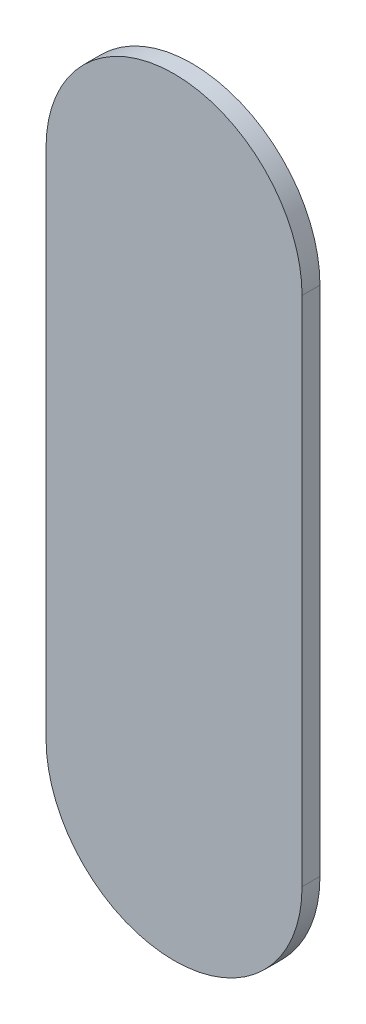
ISO-10303-21;
HEADER;
FILE_DESCRIPTION(('STEP AP214'),'2;1');
FILE_NAME('part.step','',(''),(''),'','','');
FILE_SCHEMA(('AUTOMOTIVE_DESIGN { 1 0 10303 214 1 1 1 1 }'));
ENDSEC;
DATA;
#1=APPLICATION_CONTEXT('core data for automotive mechanical design processes');
#2=APPLICATION_PROTOCOL_DEFINITION('international standard','automotive_design',2000,#1);
#3=PRODUCT_CONTEXT('',#1,'mechanical');
#4=PRODUCT('Part','Part','',(#3));
#5=PRODUCT_RELATED_PRODUCT_CATEGORY('part','',(#4));
#6=PRODUCT_DEFINITION_FORMATION('','',#4);
#7=PRODUCT_DEFINITION_CONTEXT('part definition',#1,'design');
#8=PRODUCT_DEFINITION('design','',#6,#7);
#9=PRODUCT_DEFINITION_SHAPE('','',#8);
#10=(LENGTH_UNIT() NAMED_UNIT(*) SI_UNIT(.MILLI.,.METRE.));
#11=(NAMED_UNIT(*) PLANE_ANGLE_UNIT() SI_UNIT($,.RADIAN.));
#12=(NAMED_UNIT(*) SI_UNIT($,.STERADIAN.) SOLID_ANGLE_UNIT());
#13=UNCERTAINTY_MEASURE_WITH_UNIT(LENGTH_MEASURE(1.E-05),#10,'distance_accuracy_value','');
#14=(GEOMETRIC_REPRESENTATION_CONTEXT(3) GLOBAL_UNCERTAINTY_ASSIGNED_CONTEXT((#13)) GLOBAL_UNIT_ASSIGNED_CONTEXT((#10,
#11,#12)) REPRESENTATION_CONTEXT('',''));
#15=CARTESIAN_POINT('',(0.,0.,0.));
#16=DIRECTION('',(0.,0.,1.));
#17=DIRECTION('',(1.,0.,0.));
#18=AXIS2_PLACEMENT_3D('',#15,#16,#17);
#19=CARTESIAN_POINT('',(83.5925,-108.1375,1.635));
#20=DIRECTION('',(0.,0.,1.));
#21=DIRECTION('',(1.,0.,0.));
#22=AXIS2_PLACEMENT_3D('',#19,#20,#21);
#23=PLANE('',#22);
#24=DIRECTION('',(0.,1.,0.));
#25=VECTOR('',#24,1.);
#26=CARTESIAN_POINT('',(83.5925,-108.1375,1.635));
#27=LINE('',#26,#25);
#28=CARTESIAN_POINT('',(83.5925,-108.1375,1.635));
#29=VERTEX_POINT('',#28);
#30=CARTESIAN_POINT('',(83.5925,-107.1375,1.635));
#31=VERTEX_POINT('',#30);
#32=EDGE_CURVE('E71',#29,#31,#27,.T.);
#33=ORIENTED_EDGE('',*,*,#32,.T.);
#34=CARTESIAN_POINT('',(83.3425,-107.1375,1.635));
#35=DIRECTION('',(0.,0.,1.));
#36=DIRECTION('',(1.,0.,0.));
#37=AXIS2_PLACEMENT_3D('',#34,#35,#36);
#38=CIRCLE('',#37,0.25);
#39=CARTESIAN_POINT('',(83.0925,-107.1375,1.635));
#40=VERTEX_POINT('',#39);
#41=EDGE_CURVE('E69',#31,#40,#38,.T.);
#42=ORIENTED_EDGE('',*,*,#41,.T.);
#43=DIRECTION('',(0.,-1.,0.));
#44=VECTOR('',#43,1.);
#45=CARTESIAN_POINT('',(83.0925,-107.1375,1.635));
#46=LINE('',#45,#44);
#47=CARTESIAN_POINT('',(83.0925,-108.1375,1.635));
#48=VERTEX_POINT('',#47);
#49=EDGE_CURVE('E56',#40,#48,#46,.T.);
#50=ORIENTED_EDGE('',*,*,#49,.T.);
#51=CARTESIAN_POINT('',(83.3425,-108.1375,1.635));
#52=DIRECTION('',(0.,0.,1.));
#53=DIRECTION('',(-1.,0.,0.));
#54=AXIS2_PLACEMENT_3D('',#51,#52,#53);
#55=CIRCLE('',#54,0.25);
#56=EDGE_CURVE('E11',#48,#29,#55,.T.);
#57=ORIENTED_EDGE('',*,*,#56,.T.);
#58=EDGE_LOOP('',(#33,#42,#50,#57));
#59=FACE_BOUND('',#58,.T.);
#60=ADVANCED_FACE('F17',(#59),#23,.T.);
#61=CARTESIAN_POINT('',(83.5925,-108.1375,1.6));
#62=DIRECTION('',(0.,0.,1.));
#63=DIRECTION('',(1.,0.,0.));
#64=AXIS2_PLACEMENT_3D('',#61,#62,#63);
#65=PLANE('',#64);
#66=CARTESIAN_POINT('',(83.3425,-108.1375,1.6));
#67=DIRECTION('',(0.,0.,1.));
#68=DIRECTION('',(-1.,0.,0.));
#69=AXIS2_PLACEMENT_3D('',#66,#67,#68);
#70=CIRCLE('',#69,0.25);
#71=CARTESIAN_POINT('',(83.0925,-108.1375,1.6));
#72=VERTEX_POINT('',#71);
#73=CARTESIAN_POINT('',(83.5925,-108.1375,1.6));
#74=VERTEX_POINT('',#73);
#75=EDGE_CURVE('E26',#72,#74,#70,.T.);
#76=ORIENTED_EDGE('',*,*,#75,.F.);
#77=DIRECTION('',(0.,-1.,0.));
#78=VECTOR('',#77,1.);
#79=CARTESIAN_POINT('',(83.0925,-107.1375,1.6));
#80=LINE('',#79,#78);
#81=CARTESIAN_POINT('',(83.0925,-107.1375,1.6));
#82=VERTEX_POINT('',#81);
#83=EDGE_CURVE('E76',#82,#72,#80,.T.);
#84=ORIENTED_EDGE('',*,*,#83,.F.);
#85=CARTESIAN_POINT('',(83.3425,-107.1375,1.6));
#86=DIRECTION('',(0.,0.,1.));
#87=DIRECTION('',(1.,0.,0.));
#88=AXIS2_PLACEMENT_3D('',#85,#86,#87);
#89=CIRCLE('',#88,0.25);
#90=CARTESIAN_POINT('',(83.5925,-107.1375,1.6));
#91=VERTEX_POINT('',#90);
#92=EDGE_CURVE('E80',#91,#82,#89,.T.);
#93=ORIENTED_EDGE('',*,*,#92,.F.);
#94=DIRECTION('',(0.,1.,0.));
#95=VECTOR('',#94,1.);
#96=CARTESIAN_POINT('',(83.5925,-108.1375,1.6));
#97=LINE('',#96,#95);
#98=EDGE_CURVE('E108',#74,#91,#97,.T.);
#99=ORIENTED_EDGE('',*,*,#98,.F.);
#100=EDGE_LOOP('',(#76,#84,#93,#99));
#101=FACE_BOUND('',#100,.T.);
#102=ADVANCED_FACE('F111',(#101),#65,.F.);
#103=CARTESIAN_POINT('',(83.3425,-108.1375,1.6));
#104=DIRECTION('',(0.,0.,-1.));
#105=DIRECTION('',(-1.,0.,0.));
#106=AXIS2_PLACEMENT_3D('',#103,#104,#105);
#107=CYLINDRICAL_SURFACE('',#106,0.25);
#108=ORIENTED_EDGE('',*,*,#75,.T.);
#109=DIRECTION('',(0.,0.,1.));
#110=VECTOR('',#109,1.);
#111=CARTESIAN_POINT('',(83.5925,-108.1375,1.6));
#112=LINE('',#111,#110);
#113=EDGE_CURVE('E87',#74,#29,#112,.T.);
#114=ORIENTED_EDGE('',*,*,#113,.T.);
#115=ORIENTED_EDGE('',*,*,#56,.F.);
#116=DIRECTION('',(0.,0.,1.));
#117=VECTOR('',#116,1.);
#118=CARTESIAN_POINT('',(83.0925,-108.1375,1.6));
#119=LINE('',#118,#117);
#120=EDGE_CURVE('E63',#72,#48,#119,.T.);
#121=ORIENTED_EDGE('',*,*,#120,.F.);
#122=EDGE_LOOP('',(#108,#114,#115,#121));
#123=FACE_BOUND('',#122,.T.);
#124=ADVANCED_FACE('F99',(#123),#107,.T.);
#125=CARTESIAN_POINT('',(83.0925,-107.1375,1.6));
#126=DIRECTION('',(1.,0.,0.));
#127=DIRECTION('',(0.,1.,0.));
#128=AXIS2_PLACEMENT_3D('',#125,#126,#127);
#129=PLANE('',#128);
#130=ORIENTED_EDGE('',*,*,#83,.T.);
#131=ORIENTED_EDGE('',*,*,#120,.T.);
#132=ORIENTED_EDGE('',*,*,#49,.F.);
#133=DIRECTION('',(0.,0.,1.));
#134=VECTOR('',#133,1.);
#135=CARTESIAN_POINT('',(83.0925,-107.1375,1.6));
#136=LINE('',#135,#134);
#137=EDGE_CURVE('E61',#82,#40,#136,.T.);
#138=ORIENTED_EDGE('',*,*,#137,.F.);
#139=EDGE_LOOP('',(#130,#131,#132,#138));
#140=FACE_BOUND('',#139,.T.);
#141=ADVANCED_FACE('F59',(#140),#129,.F.);
#142=CARTESIAN_POINT('',(83.3425,-107.1375,1.6));
#143=DIRECTION('',(0.,0.,-1.));
#144=DIRECTION('',(1.,0.,0.));
#145=AXIS2_PLACEMENT_3D('',#142,#143,#144);
#146=CYLINDRICAL_SURFACE('',#145,0.25);
#147=ORIENTED_EDGE('',*,*,#92,.T.);
#148=ORIENTED_EDGE('',*,*,#137,.T.);
#149=ORIENTED_EDGE('',*,*,#41,.F.);
#150=DIRECTION('',(0.,0.,1.));
#151=VECTOR('',#150,1.);
#152=CARTESIAN_POINT('',(83.5925,-107.1375,1.6));
#153=LINE('',#152,#151);
#154=EDGE_CURVE('E113',#91,#31,#153,.T.);
#155=ORIENTED_EDGE('',*,*,#154,.F.);
#156=EDGE_LOOP('',(#147,#148,#149,#155));
#157=FACE_BOUND('',#156,.T.);
#158=ADVANCED_FACE('F78',(#157),#146,.T.);
#159=CARTESIAN_POINT('',(83.5925,-108.1375,1.6));
#160=DIRECTION('',(-1.,0.,0.));
#161=DIRECTION('',(0.,0.,1.));
#162=AXIS2_PLACEMENT_3D('',#159,#160,#161);
#163=PLANE('',#162);
#164=ORIENTED_EDGE('',*,*,#98,.T.);
#165=ORIENTED_EDGE('',*,*,#154,.T.);
#166=ORIENTED_EDGE('',*,*,#32,.F.);
#167=ORIENTED_EDGE('',*,*,#113,.F.);
#168=EDGE_LOOP('',(#164,#165,#166,#167));
#169=FACE_BOUND('',#168,.T.);
#170=ADVANCED_FACE('F107',(#169),#163,.F.);
#171=CLOSED_SHELL('',(#60,#102,#124,#141,#158,#170));
#172=MANIFOLD_SOLID_BREP('B1',#171);
#173=ADVANCED_BREP_SHAPE_REPRESENTATION('',(#18,#172),#14);
#174=SHAPE_DEFINITION_REPRESENTATION(#9,#173);
ENDSEC;
END-ISO-10303-21;
